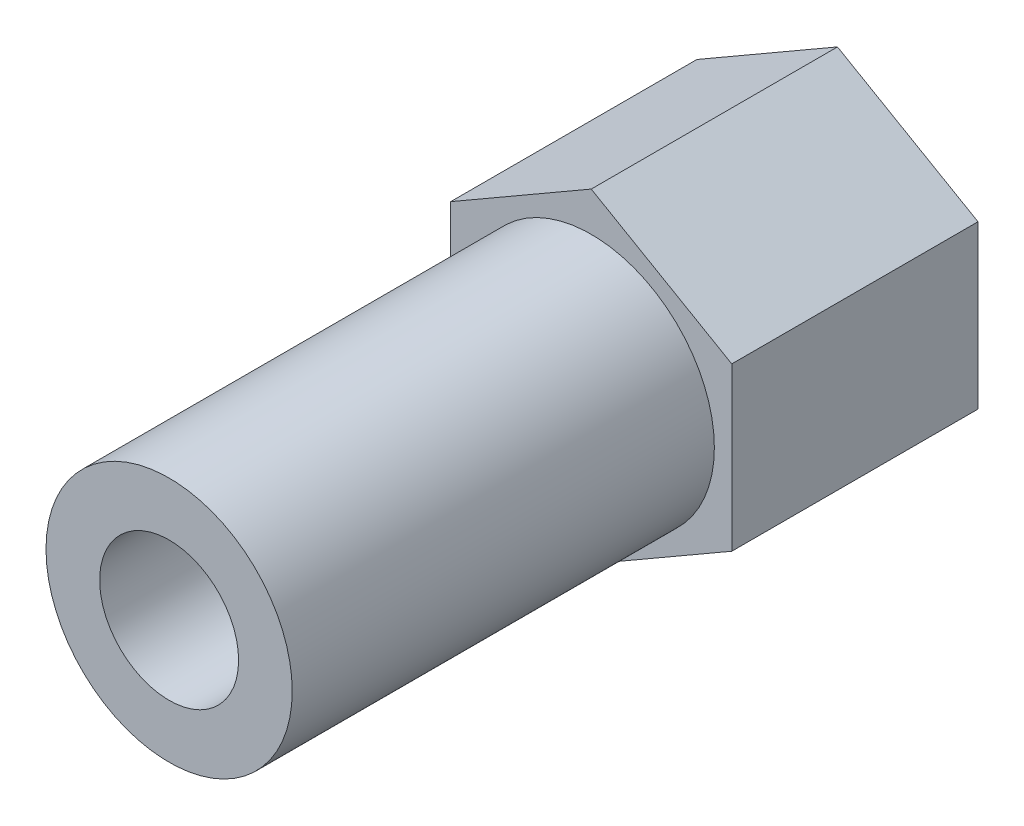
ISO-10303-21;
HEADER;
FILE_DESCRIPTION(('STEP AP214'),'2;1');
FILE_NAME('part.step','',(''),(''),'','','');
FILE_SCHEMA(('AUTOMOTIVE_DESIGN { 1 0 10303 214 1 1 1 1 }'));
ENDSEC;
DATA;
#1=APPLICATION_CONTEXT('core data for automotive mechanical design processes');
#2=APPLICATION_PROTOCOL_DEFINITION('international standard','automotive_design',2000,#1);
#3=PRODUCT_CONTEXT('',#1,'mechanical');
#4=PRODUCT('Part','Part','',(#3));
#5=PRODUCT_RELATED_PRODUCT_CATEGORY('part','',(#4));
#6=PRODUCT_DEFINITION_FORMATION('','',#4);
#7=PRODUCT_DEFINITION_CONTEXT('part definition',#1,'design');
#8=PRODUCT_DEFINITION('design','',#6,#7);
#9=PRODUCT_DEFINITION_SHAPE('','',#8);
#10=(LENGTH_UNIT() NAMED_UNIT(*) SI_UNIT(.MILLI.,.METRE.));
#11=(NAMED_UNIT(*) PLANE_ANGLE_UNIT() SI_UNIT($,.RADIAN.));
#12=(NAMED_UNIT(*) SI_UNIT($,.STERADIAN.) SOLID_ANGLE_UNIT());
#13=UNCERTAINTY_MEASURE_WITH_UNIT(LENGTH_MEASURE(1.E-05),#10,'distance_accuracy_value','');
#14=(GEOMETRIC_REPRESENTATION_CONTEXT(3) GLOBAL_UNCERTAINTY_ASSIGNED_CONTEXT((#13)) GLOBAL_UNIT_ASSIGNED_CONTEXT((#10,
#11,#12)) REPRESENTATION_CONTEXT('',''));
#15=CARTESIAN_POINT('',(0.,0.,0.));
#16=DIRECTION('',(0.,0.,1.));
#17=DIRECTION('',(1.,0.,0.));
#18=AXIS2_PLACEMENT_3D('',#15,#16,#17);
#19=CARTESIAN_POINT('',(0.,0.,7.));
#20=DIRECTION('',(0.,0.,1.));
#21=DIRECTION('',(1.,0.,0.));
#22=AXIS2_PLACEMENT_3D('',#19,#20,#21);
#23=PLANE('',#22);
#24=CARTESIAN_POINT('',(0.,0.,7.));
#25=DIRECTION('',(0.,0.,1.));
#26=DIRECTION('',(1.,0.,0.));
#27=AXIS2_PLACEMENT_3D('',#24,#25,#26);
#28=CIRCLE('',#27,3.5);
#29=CARTESIAN_POINT('',(3.5,0.,7.));
#30=VERTEX_POINT('',#29);
#31=EDGE_CURVE('E188',#30,#30,#28,.T.);
#32=ORIENTED_EDGE('',*,*,#31,.F.);
#33=EDGE_LOOP('',(#32));
#34=FACE_BOUND('',#33,.T.);
#35=DIRECTION('',(-0.866025403784441,0.499999999999995,0.));
#36=VECTOR('',#35,1.);
#37=CARTESIAN_POINT('',(3.99499999999997,2.3065143254126,7.));
#38=LINE('',#37,#36);
#39=CARTESIAN_POINT('',(3.99499999999997,2.3065143254126,7.));
#40=VERTEX_POINT('',#39);
#41=CARTESIAN_POINT('',(0.,4.6130286508251,7.));
#42=VERTEX_POINT('',#41);
#43=EDGE_CURVE('E130',#40,#42,#38,.T.);
#44=ORIENTED_EDGE('',*,*,#43,.T.);
#45=DIRECTION('',(-0.866025403784438,-0.500000000000001,0.));
#46=VECTOR('',#45,1.);
#47=CARTESIAN_POINT('',(0.,4.6130286508251,7.));
#48=LINE('',#47,#46);
#49=CARTESIAN_POINT('',(-3.995,2.30651432541254,7.));
#50=VERTEX_POINT('',#49);
#51=EDGE_CURVE('E89',#42,#50,#48,.T.);
#52=ORIENTED_EDGE('',*,*,#51,.T.);
#53=DIRECTION('',(0.,-1.,0.));
#54=VECTOR('',#53,1.);
#55=CARTESIAN_POINT('',(-3.995,2.30651432541254,7.));
#56=LINE('',#55,#54);
#57=CARTESIAN_POINT('',(-3.99499999999998,-2.30651432541257,7.));
#58=VERTEX_POINT('',#57);
#59=EDGE_CURVE('E101',#50,#58,#56,.T.);
#60=ORIENTED_EDGE('',*,*,#59,.T.);
#61=DIRECTION('',(0.866025403784442,-0.499999999999995,0.));
#62=VECTOR('',#61,1.);
#63=CARTESIAN_POINT('',(-3.99499999999998,-2.30651432541257,7.));
#64=LINE('',#63,#62);
#65=CARTESIAN_POINT('',(0.,-4.6130286508251,7.));
#66=VERTEX_POINT('',#65);
#67=EDGE_CURVE('E96',#58,#66,#64,.T.);
#68=ORIENTED_EDGE('',*,*,#67,.T.);
#69=DIRECTION('',(0.866025403784435,0.500000000000007,0.));
#70=VECTOR('',#69,1.);
#71=CARTESIAN_POINT('',(0.,-4.6130286508251,7.));
#72=LINE('',#71,#70);
#73=CARTESIAN_POINT('',(3.99500000000002,-2.30651432541251,7.));
#74=VERTEX_POINT('',#73);
#75=EDGE_CURVE('E99',#66,#74,#72,.T.);
#76=ORIENTED_EDGE('',*,*,#75,.T.);
#77=DIRECTION('',(0.,1.,0.));
#78=VECTOR('',#77,1.);
#79=CARTESIAN_POINT('',(3.99500000000002,-2.30651432541251,7.));
#80=LINE('',#79,#78);
#81=EDGE_CURVE('E52',#74,#40,#80,.T.);
#82=ORIENTED_EDGE('',*,*,#81,.T.);
#83=EDGE_LOOP('',(#44,#52,#60,#68,#76,#82));
#84=FACE_BOUND('',#83,.T.);
#85=ADVANCED_FACE('F35',(#34,#84),#23,.T.);
#86=CARTESIAN_POINT('',(0.,0.,0.));
#87=DIRECTION('',(0.,0.,1.));
#88=DIRECTION('',(1.,0.,0.));
#89=AXIS2_PLACEMENT_3D('',#86,#87,#88);
#90=PLANE('',#89);
#91=DIRECTION('',(-0.866025403784441,0.499999999999995,0.));
#92=VECTOR('',#91,1.);
#93=CARTESIAN_POINT('',(3.99499999999997,2.3065143254126,0.));
#94=LINE('',#93,#92);
#95=CARTESIAN_POINT('',(3.99499999999997,2.3065143254126,0.));
#96=VERTEX_POINT('',#95);
#97=CARTESIAN_POINT('',(0.,4.6130286508251,0.));
#98=VERTEX_POINT('',#97);
#99=EDGE_CURVE('E119',#96,#98,#94,.T.);
#100=ORIENTED_EDGE('',*,*,#99,.F.);
#101=DIRECTION('',(0.,1.,0.));
#102=VECTOR('',#101,1.);
#103=CARTESIAN_POINT('',(3.99500000000002,-2.30651432541251,0.));
#104=LINE('',#103,#102);
#105=CARTESIAN_POINT('',(3.99500000000002,-2.30651432541251,0.));
#106=VERTEX_POINT('',#105);
#107=EDGE_CURVE('E81',#106,#96,#104,.T.);
#108=ORIENTED_EDGE('',*,*,#107,.F.);
#109=DIRECTION('',(0.866025403784435,0.500000000000007,0.));
#110=VECTOR('',#109,1.);
#111=CARTESIAN_POINT('',(0.,-4.6130286508251,0.));
#112=LINE('',#111,#110);
#113=CARTESIAN_POINT('',(0.,-4.6130286508251,0.));
#114=VERTEX_POINT('',#113);
#115=EDGE_CURVE('E75',#114,#106,#112,.T.);
#116=ORIENTED_EDGE('',*,*,#115,.F.);
#117=DIRECTION('',(0.866025403784442,-0.499999999999995,0.));
#118=VECTOR('',#117,1.);
#119=CARTESIAN_POINT('',(-3.99499999999998,-2.30651432541257,0.));
#120=LINE('',#119,#118);
#121=CARTESIAN_POINT('',(-3.99499999999998,-2.30651432541257,0.));
#122=VERTEX_POINT('',#121);
#123=EDGE_CURVE('E109',#122,#114,#120,.T.);
#124=ORIENTED_EDGE('',*,*,#123,.F.);
#125=DIRECTION('',(0.,-1.,0.));
#126=VECTOR('',#125,1.);
#127=CARTESIAN_POINT('',(-3.995,2.30651432541254,0.));
#128=LINE('',#127,#126);
#129=CARTESIAN_POINT('',(-3.995,2.30651432541254,0.));
#130=VERTEX_POINT('',#129);
#131=EDGE_CURVE('E125',#130,#122,#128,.T.);
#132=ORIENTED_EDGE('',*,*,#131,.F.);
#133=DIRECTION('',(-0.866025403784438,-0.500000000000001,0.));
#134=VECTOR('',#133,1.);
#135=CARTESIAN_POINT('',(0.,4.6130286508251,0.));
#136=LINE('',#135,#134);
#137=EDGE_CURVE('E122',#98,#130,#136,.T.);
#138=ORIENTED_EDGE('',*,*,#137,.F.);
#139=EDGE_LOOP('',(#100,#108,#116,#124,#132,#138));
#140=FACE_BOUND('',#139,.T.);
#141=CARTESIAN_POINT('',(0.,0.,0.));
#142=DIRECTION('',(0.,0.,1.));
#143=DIRECTION('',(1.,0.,0.));
#144=AXIS2_PLACEMENT_3D('',#141,#142,#143);
#145=CIRCLE('',#144,2.);
#146=CARTESIAN_POINT('',(2.,0.,0.));
#147=VERTEX_POINT('',#146);
#148=EDGE_CURVE('E123',#147,#147,#145,.T.);
#149=ORIENTED_EDGE('',*,*,#148,.T.);
#150=EDGE_LOOP('',(#149));
#151=FACE_BOUND('',#150,.T.);
#152=ADVANCED_FACE('F139',(#140,#151),#90,.F.);
#153=CARTESIAN_POINT('',(3.99499999999997,2.3065143254126,7.));
#154=DIRECTION('',(-0.499999999999995,-0.866025403784441,0.));
#155=DIRECTION('',(0.866025403784441,-0.499999999999995,0.));
#156=AXIS2_PLACEMENT_3D('',#153,#154,#155);
#157=PLANE('',#156);
#158=ORIENTED_EDGE('',*,*,#99,.T.);
#159=DIRECTION('',(0.,0.,-1.));
#160=VECTOR('',#159,1.);
#161=CARTESIAN_POINT('',(0.,4.6130286508251,7.));
#162=LINE('',#161,#160);
#163=EDGE_CURVE('E11',#42,#98,#162,.T.);
#164=ORIENTED_EDGE('',*,*,#163,.F.);
#165=ORIENTED_EDGE('',*,*,#43,.F.);
#166=DIRECTION('',(0.,0.,-1.));
#167=VECTOR('',#166,1.);
#168=CARTESIAN_POINT('',(3.99499999999997,2.3065143254126,7.));
#169=LINE('',#168,#167);
#170=EDGE_CURVE('E115',#40,#96,#169,.T.);
#171=ORIENTED_EDGE('',*,*,#170,.T.);
#172=EDGE_LOOP('',(#158,#164,#165,#171));
#173=FACE_BOUND('',#172,.T.);
#174=ADVANCED_FACE('F37',(#173),#157,.F.);
#175=CARTESIAN_POINT('',(0.,4.6130286508251,7.));
#176=DIRECTION('',(0.500000000000001,-0.866025403784438,0.));
#177=DIRECTION('',(0.866025403784438,0.500000000000001,0.));
#178=AXIS2_PLACEMENT_3D('',#175,#176,#177);
#179=PLANE('',#178);
#180=ORIENTED_EDGE('',*,*,#137,.T.);
#181=DIRECTION('',(0.,0.,-1.));
#182=VECTOR('',#181,1.);
#183=CARTESIAN_POINT('',(-3.995,2.30651432541254,7.));
#184=LINE('',#183,#182);
#185=EDGE_CURVE('E44',#50,#130,#184,.T.);
#186=ORIENTED_EDGE('',*,*,#185,.F.);
#187=ORIENTED_EDGE('',*,*,#51,.F.);
#188=ORIENTED_EDGE('',*,*,#163,.T.);
#189=EDGE_LOOP('',(#180,#186,#187,#188));
#190=FACE_BOUND('',#189,.T.);
#191=ADVANCED_FACE('F255',(#190),#179,.F.);
#192=CARTESIAN_POINT('',(-3.995,2.30651432541254,7.));
#193=DIRECTION('',(1.,0.,0.));
#194=DIRECTION('',(0.,1.,0.));
#195=AXIS2_PLACEMENT_3D('',#192,#193,#194);
#196=PLANE('',#195);
#197=ORIENTED_EDGE('',*,*,#131,.T.);
#198=DIRECTION('',(0.,0.,-1.));
#199=VECTOR('',#198,1.);
#200=CARTESIAN_POINT('',(-3.99499999999998,-2.30651432541257,7.));
#201=LINE('',#200,#199);
#202=EDGE_CURVE('E110',#58,#122,#201,.T.);
#203=ORIENTED_EDGE('',*,*,#202,.F.);
#204=ORIENTED_EDGE('',*,*,#59,.F.);
#205=ORIENTED_EDGE('',*,*,#185,.T.);
#206=EDGE_LOOP('',(#197,#203,#204,#205));
#207=FACE_BOUND('',#206,.T.);
#208=ADVANCED_FACE('F136',(#207),#196,.F.);
#209=CARTESIAN_POINT('',(-3.99499999999998,-2.30651432541257,7.));
#210=DIRECTION('',(0.499999999999995,0.866025403784441,0.));
#211=DIRECTION('',(-0.866025403784442,0.499999999999995,0.));
#212=AXIS2_PLACEMENT_3D('',#209,#210,#211);
#213=PLANE('',#212);
#214=ORIENTED_EDGE('',*,*,#123,.T.);
#215=DIRECTION('',(0.,0.,-1.));
#216=VECTOR('',#215,1.);
#217=CARTESIAN_POINT('',(0.,-4.6130286508251,7.));
#218=LINE('',#217,#216);
#219=EDGE_CURVE('E106',#66,#114,#218,.T.);
#220=ORIENTED_EDGE('',*,*,#219,.F.);
#221=ORIENTED_EDGE('',*,*,#67,.F.);
#222=ORIENTED_EDGE('',*,*,#202,.T.);
#223=EDGE_LOOP('',(#214,#220,#221,#222));
#224=FACE_BOUND('',#223,.T.);
#225=ADVANCED_FACE('F107',(#224),#213,.F.);
#226=CARTESIAN_POINT('',(0.,-4.6130286508251,7.));
#227=DIRECTION('',(-0.500000000000007,0.866025403784435,0.));
#228=DIRECTION('',(-0.866025403784435,-0.500000000000007,0.));
#229=AXIS2_PLACEMENT_3D('',#226,#227,#228);
#230=PLANE('',#229);
#231=ORIENTED_EDGE('',*,*,#115,.T.);
#232=DIRECTION('',(0.,0.,-1.));
#233=VECTOR('',#232,1.);
#234=CARTESIAN_POINT('',(3.99500000000002,-2.30651432541251,7.));
#235=LINE('',#234,#233);
#236=EDGE_CURVE('E111',#74,#106,#235,.T.);
#237=ORIENTED_EDGE('',*,*,#236,.F.);
#238=ORIENTED_EDGE('',*,*,#75,.F.);
#239=ORIENTED_EDGE('',*,*,#219,.T.);
#240=EDGE_LOOP('',(#231,#237,#238,#239));
#241=FACE_BOUND('',#240,.T.);
#242=ADVANCED_FACE('F113',(#241),#230,.F.);
#243=CARTESIAN_POINT('',(3.99500000000002,-2.30651432541251,7.));
#244=DIRECTION('',(-1.,0.,0.));
#245=DIRECTION('',(0.,-1.,0.));
#246=AXIS2_PLACEMENT_3D('',#243,#244,#245);
#247=PLANE('',#246);
#248=ORIENTED_EDGE('',*,*,#107,.T.);
#249=ORIENTED_EDGE('',*,*,#170,.F.);
#250=ORIENTED_EDGE('',*,*,#81,.F.);
#251=ORIENTED_EDGE('',*,*,#236,.T.);
#252=EDGE_LOOP('',(#248,#249,#250,#251));
#253=FACE_BOUND('',#252,.T.);
#254=ADVANCED_FACE('F144',(#253),#247,.F.);
#255=CARTESIAN_POINT('',(0.,0.,7.));
#256=DIRECTION('',(0.,0.,-1.));
#257=DIRECTION('',(-1.,0.,0.));
#258=AXIS2_PLACEMENT_3D('',#255,#256,#257);
#259=CYLINDRICAL_SURFACE('',#258,2.);
#260=CARTESIAN_POINT('',(0.,0.,7.));
#261=DIRECTION('',(0.,0.,1.));
#262=DIRECTION('',(1.,0.,0.));
#263=AXIS2_PLACEMENT_3D('',#260,#261,#262);
#264=CIRCLE('',#263,2.);
#265=CARTESIAN_POINT('',(2.,0.,7.));
#266=VERTEX_POINT('',#265);
#267=EDGE_CURVE('E198',#266,#266,#264,.T.);
#268=ORIENTED_EDGE('',*,*,#267,.T.);
#269=EDGE_LOOP('',(#268));
#270=FACE_BOUND('',#269,.T.);
#271=ORIENTED_EDGE('',*,*,#148,.F.);
#272=EDGE_LOOP('',(#271));
#273=FACE_BOUND('',#272,.T.);
#274=ADVANCED_FACE('F146',(#270,#273),#259,.F.);
#275=CARTESIAN_POINT('',(0.,0.,7.));
#276=DIRECTION('',(0.,0.,1.));
#277=DIRECTION('',(1.,0.,0.));
#278=AXIS2_PLACEMENT_3D('',#275,#276,#277);
#279=PLANE('',#278);
#280=ORIENTED_EDGE('',*,*,#267,.F.);
#281=EDGE_LOOP('',(#280));
#282=FACE_BOUND('',#281,.T.);
#283=ADVANCED_FACE('F152',(#282),#279,.F.);
#284=CARTESIAN_POINT('',(0.,0.,19.));
#285=DIRECTION('',(0.,0.,-1.));
#286=DIRECTION('',(-1.,0.,0.));
#287=AXIS2_PLACEMENT_3D('',#284,#285,#286);
#288=CYLINDRICAL_SURFACE('',#287,3.5);
#289=CARTESIAN_POINT('',(0.,0.,19.));
#290=DIRECTION('',(0.,0.,1.));
#291=DIRECTION('',(1.,0.,0.));
#292=AXIS2_PLACEMENT_3D('',#289,#290,#291);
#293=CIRCLE('',#292,3.5);
#294=CARTESIAN_POINT('',(3.5,0.,19.));
#295=VERTEX_POINT('',#294);
#296=EDGE_CURVE('E192',#295,#295,#293,.T.);
#297=ORIENTED_EDGE('',*,*,#296,.F.);
#298=EDGE_LOOP('',(#297));
#299=FACE_BOUND('',#298,.T.);
#300=ORIENTED_EDGE('',*,*,#31,.T.);
#301=EDGE_LOOP('',(#300));
#302=FACE_BOUND('',#301,.T.);
#303=ADVANCED_FACE('F165',(#299,#302),#288,.T.);
#304=CARTESIAN_POINT('',(0.,0.,19.));
#305=DIRECTION('',(0.,0.,1.));
#306=DIRECTION('',(1.,0.,0.));
#307=AXIS2_PLACEMENT_3D('',#304,#305,#306);
#308=PLANE('',#307);
#309=CARTESIAN_POINT('',(0.,0.,19.));
#310=DIRECTION('',(0.,0.,1.));
#311=DIRECTION('',(1.,0.,0.));
#312=AXIS2_PLACEMENT_3D('',#309,#310,#311);
#313=CIRCLE('',#312,1.975);
#314=CARTESIAN_POINT('',(1.975,0.,19.));
#315=VERTEX_POINT('',#314);
#316=EDGE_CURVE('E189',#315,#315,#313,.T.);
#317=ORIENTED_EDGE('',*,*,#316,.F.);
#318=EDGE_LOOP('',(#317));
#319=FACE_BOUND('',#318,.T.);
#320=ORIENTED_EDGE('',*,*,#296,.T.);
#321=EDGE_LOOP('',(#320));
#322=FACE_BOUND('',#321,.T.);
#323=ADVANCED_FACE('F168',(#319,#322),#308,.T.);
#324=CARTESIAN_POINT('',(0.,0.,11.));
#325=DIRECTION('',(0.,0.,1.));
#326=DIRECTION('',(1.,0.,0.));
#327=AXIS2_PLACEMENT_3D('',#324,#325,#326);
#328=CYLINDRICAL_SURFACE('',#327,1.975);
#329=CARTESIAN_POINT('',(0.,0.,11.));
#330=DIRECTION('',(0.,0.,1.));
#331=DIRECTION('',(1.,0.,0.));
#332=AXIS2_PLACEMENT_3D('',#329,#330,#331);
#333=CIRCLE('',#332,1.975);
#334=CARTESIAN_POINT('',(1.975,0.,11.));
#335=VERTEX_POINT('',#334);
#336=EDGE_CURVE('E187',#335,#335,#333,.T.);
#337=ORIENTED_EDGE('',*,*,#336,.F.);
#338=EDGE_LOOP('',(#337));
#339=FACE_BOUND('',#338,.T.);
#340=ORIENTED_EDGE('',*,*,#316,.T.);
#341=EDGE_LOOP('',(#340));
#342=FACE_BOUND('',#341,.T.);
#343=ADVANCED_FACE('F175',(#339,#342),#328,.F.);
#344=CARTESIAN_POINT('',(0.,0.,11.));
#345=DIRECTION('',(0.,0.,1.));
#346=DIRECTION('',(1.,0.,0.));
#347=AXIS2_PLACEMENT_3D('',#344,#345,#346);
#348=PLANE('',#347);
#349=ORIENTED_EDGE('',*,*,#336,.T.);
#350=EDGE_LOOP('',(#349));
#351=FACE_BOUND('',#350,.T.);
#352=ADVANCED_FACE('F179',(#351),#348,.T.);
#353=CLOSED_SHELL('',(#85,#152,#174,#191,#208,#225,#242,#254,#274,#283,#303,#323,#343,#352));
#354=MANIFOLD_SOLID_BREP('B2',#353);
#355=ADVANCED_BREP_SHAPE_REPRESENTATION('',(#18,#354),#14);
#356=SHAPE_DEFINITION_REPRESENTATION(#9,#355);
ENDSEC;
END-ISO-10303-21;
